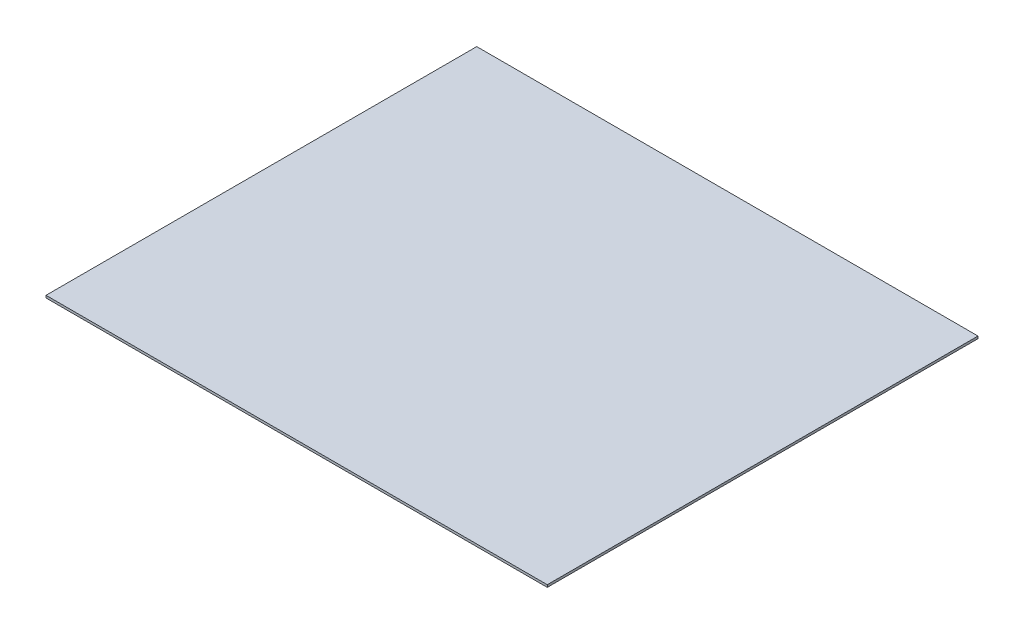
ISO-10303-21;
HEADER;
FILE_DESCRIPTION(('STEP AP214'),'2;1');
FILE_NAME('part.step','',(''),(''),'','','');
FILE_SCHEMA(('AUTOMOTIVE_DESIGN { 1 0 10303 214 1 1 1 1 }'));
ENDSEC;
DATA;
#1=APPLICATION_CONTEXT('core data for automotive mechanical design processes');
#2=APPLICATION_PROTOCOL_DEFINITION('international standard','automotive_design',2000,#1);
#3=PRODUCT_CONTEXT('',#1,'mechanical');
#4=PRODUCT('Part','Part','',(#3));
#5=PRODUCT_RELATED_PRODUCT_CATEGORY('part','',(#4));
#6=PRODUCT_DEFINITION_FORMATION('','',#4);
#7=PRODUCT_DEFINITION_CONTEXT('part definition',#1,'design');
#8=PRODUCT_DEFINITION('design','',#6,#7);
#9=PRODUCT_DEFINITION_SHAPE('','',#8);
#10=(LENGTH_UNIT() NAMED_UNIT(*) SI_UNIT(.MILLI.,.METRE.));
#11=(NAMED_UNIT(*) PLANE_ANGLE_UNIT() SI_UNIT($,.RADIAN.));
#12=(NAMED_UNIT(*) SI_UNIT($,.STERADIAN.) SOLID_ANGLE_UNIT());
#13=UNCERTAINTY_MEASURE_WITH_UNIT(LENGTH_MEASURE(1.E-05),#10,'distance_accuracy_value','');
#14=(GEOMETRIC_REPRESENTATION_CONTEXT(3) GLOBAL_UNCERTAINTY_ASSIGNED_CONTEXT((#13)) GLOBAL_UNIT_ASSIGNED_CONTEXT((#10,
#11,#12)) REPRESENTATION_CONTEXT('',''));
#15=CARTESIAN_POINT('',(0.,0.,0.));
#16=DIRECTION('',(0.,0.,1.));
#17=DIRECTION('',(1.,0.,0.));
#18=AXIS2_PLACEMENT_3D('',#15,#16,#17);
#19=CARTESIAN_POINT('',(-536.5,5.,461.));
#20=DIRECTION('',(1.,0.,0.));
#21=DIRECTION('',(0.,0.,-1.));
#22=AXIS2_PLACEMENT_3D('',#19,#20,#21);
#23=PLANE('',#22);
#24=DIRECTION('',(0.,0.,1.));
#25=VECTOR('',#24,1.);
#26=CARTESIAN_POINT('',(-536.5,0.,461.));
#27=LINE('',#26,#25);
#28=CARTESIAN_POINT('',(-536.5,0.,-461.));
#29=VERTEX_POINT('',#28);
#30=CARTESIAN_POINT('',(-536.5,0.,461.));
#31=VERTEX_POINT('',#30);
#32=EDGE_CURVE('E98',#29,#31,#27,.T.);
#33=ORIENTED_EDGE('',*,*,#32,.T.);
#34=DIRECTION('',(0.,-1.,0.));
#35=VECTOR('',#34,1.);
#36=CARTESIAN_POINT('',(-536.5,5.,461.));
#37=LINE('',#36,#35);
#38=CARTESIAN_POINT('',(-536.5,5.,461.));
#39=VERTEX_POINT('',#38);
#40=EDGE_CURVE('E11',#39,#31,#37,.T.);
#41=ORIENTED_EDGE('',*,*,#40,.F.);
#42=DIRECTION('',(0.,0.,1.));
#43=VECTOR('',#42,1.);
#44=CARTESIAN_POINT('',(-536.5,5.,461.));
#45=LINE('',#44,#43);
#46=CARTESIAN_POINT('',(-536.5,5.,-461.));
#47=VERTEX_POINT('',#46);
#48=EDGE_CURVE('E86',#47,#39,#45,.T.);
#49=ORIENTED_EDGE('',*,*,#48,.F.);
#50=DIRECTION('',(0.,-1.,0.));
#51=VECTOR('',#50,1.);
#52=CARTESIAN_POINT('',(-536.5,5.,-461.));
#53=LINE('',#52,#51);
#54=EDGE_CURVE('E94',#47,#29,#53,.T.);
#55=ORIENTED_EDGE('',*,*,#54,.T.);
#56=EDGE_LOOP('',(#33,#41,#49,#55));
#57=FACE_BOUND('',#56,.T.);
#58=ADVANCED_FACE('F35',(#57),#23,.F.);
#59=CARTESIAN_POINT('',(536.5,5.,461.));
#60=DIRECTION('',(0.,0.,-1.));
#61=DIRECTION('',(-1.,0.,0.));
#62=AXIS2_PLACEMENT_3D('',#59,#60,#61);
#63=PLANE('',#62);
#64=DIRECTION('',(1.,0.,0.));
#65=VECTOR('',#64,1.);
#66=CARTESIAN_POINT('',(536.5,0.,461.));
#67=LINE('',#66,#65);
#68=CARTESIAN_POINT('',(536.5,0.,461.));
#69=VERTEX_POINT('',#68);
#70=EDGE_CURVE('E90',#31,#69,#67,.T.);
#71=ORIENTED_EDGE('',*,*,#70,.T.);
#72=DIRECTION('',(0.,-1.,0.));
#73=VECTOR('',#72,1.);
#74=CARTESIAN_POINT('',(536.5,5.,461.));
#75=LINE('',#74,#73);
#76=CARTESIAN_POINT('',(536.5,5.,461.));
#77=VERTEX_POINT('',#76);
#78=EDGE_CURVE('E43',#77,#69,#75,.T.);
#79=ORIENTED_EDGE('',*,*,#78,.F.);
#80=DIRECTION('',(1.,0.,0.));
#81=VECTOR('',#80,1.);
#82=CARTESIAN_POINT('',(536.5,5.,461.));
#83=LINE('',#82,#81);
#84=EDGE_CURVE('E81',#39,#77,#83,.T.);
#85=ORIENTED_EDGE('',*,*,#84,.F.);
#86=ORIENTED_EDGE('',*,*,#40,.T.);
#87=EDGE_LOOP('',(#71,#79,#85,#86));
#88=FACE_BOUND('',#87,.T.);
#89=ADVANCED_FACE('F89',(#88),#63,.F.);
#90=CARTESIAN_POINT('',(536.5,5.,461.));
#91=DIRECTION('',(-1.,0.,0.));
#92=DIRECTION('',(0.,0.,1.));
#93=AXIS2_PLACEMENT_3D('',#90,#91,#92);
#94=PLANE('',#93);
#95=DIRECTION('',(0.,0.,-1.));
#96=VECTOR('',#95,1.);
#97=CARTESIAN_POINT('',(536.5,0.,461.));
#98=LINE('',#97,#96);
#99=CARTESIAN_POINT('',(536.5,0.,-461.));
#100=VERTEX_POINT('',#99);
#101=EDGE_CURVE('E68',#69,#100,#98,.T.);
#102=ORIENTED_EDGE('',*,*,#101,.T.);
#103=DIRECTION('',(0.,-1.,0.));
#104=VECTOR('',#103,1.);
#105=CARTESIAN_POINT('',(536.5,5.,-461.));
#106=LINE('',#105,#104);
#107=CARTESIAN_POINT('',(536.5,5.,-461.));
#108=VERTEX_POINT('',#107);
#109=EDGE_CURVE('E91',#108,#100,#106,.T.);
#110=ORIENTED_EDGE('',*,*,#109,.F.);
#111=DIRECTION('',(0.,0.,-1.));
#112=VECTOR('',#111,1.);
#113=CARTESIAN_POINT('',(536.5,5.,461.));
#114=LINE('',#113,#112);
#115=EDGE_CURVE('E84',#77,#108,#114,.T.);
#116=ORIENTED_EDGE('',*,*,#115,.F.);
#117=ORIENTED_EDGE('',*,*,#78,.T.);
#118=EDGE_LOOP('',(#102,#110,#116,#117));
#119=FACE_BOUND('',#118,.T.);
#120=ADVANCED_FACE('F92',(#119),#94,.F.);
#121=CARTESIAN_POINT('',(536.5,5.,-461.));
#122=DIRECTION('',(0.,0.,1.));
#123=DIRECTION('',(1.,0.,0.));
#124=AXIS2_PLACEMENT_3D('',#121,#122,#123);
#125=PLANE('',#124);
#126=DIRECTION('',(-1.,0.,0.));
#127=VECTOR('',#126,1.);
#128=CARTESIAN_POINT('',(536.5,0.,-461.));
#129=LINE('',#128,#127);
#130=EDGE_CURVE('E74',#100,#29,#129,.T.);
#131=ORIENTED_EDGE('',*,*,#130,.T.);
#132=ORIENTED_EDGE('',*,*,#54,.F.);
#133=DIRECTION('',(-1.,0.,0.));
#134=VECTOR('',#133,1.);
#135=CARTESIAN_POINT('',(536.5,5.,-461.));
#136=LINE('',#135,#134);
#137=EDGE_CURVE('E51',#108,#47,#136,.T.);
#138=ORIENTED_EDGE('',*,*,#137,.F.);
#139=ORIENTED_EDGE('',*,*,#109,.T.);
#140=EDGE_LOOP('',(#131,#132,#138,#139));
#141=FACE_BOUND('',#140,.T.);
#142=ADVANCED_FACE('F105',(#141),#125,.F.);
#143=CARTESIAN_POINT('',(-536.5,5.,-461.));
#144=DIRECTION('',(0.,1.,0.));
#145=DIRECTION('',(0.,0.,1.));
#146=AXIS2_PLACEMENT_3D('',#143,#144,#145);
#147=PLANE('',#146);
#148=ORIENTED_EDGE('',*,*,#48,.T.);
#149=ORIENTED_EDGE('',*,*,#84,.T.);
#150=ORIENTED_EDGE('',*,*,#115,.T.);
#151=ORIENTED_EDGE('',*,*,#137,.T.);
#152=EDGE_LOOP('',(#148,#149,#150,#151));
#153=FACE_BOUND('',#152,.T.);
#154=ADVANCED_FACE('F82',(#153),#147,.T.);
#155=CARTESIAN_POINT('',(-536.5,0.,-461.));
#156=DIRECTION('',(0.,1.,0.));
#157=DIRECTION('',(0.,0.,1.));
#158=AXIS2_PLACEMENT_3D('',#155,#156,#157);
#159=PLANE('',#158);
#160=ORIENTED_EDGE('',*,*,#32,.F.);
#161=ORIENTED_EDGE('',*,*,#130,.F.);
#162=ORIENTED_EDGE('',*,*,#101,.F.);
#163=ORIENTED_EDGE('',*,*,#70,.F.);
#164=EDGE_LOOP('',(#160,#161,#162,#163));
#165=FACE_BOUND('',#164,.T.);
#166=ADVANCED_FACE('F108',(#165),#159,.F.);
#167=CLOSED_SHELL('',(#58,#89,#120,#142,#154,#166));
#168=MANIFOLD_SOLID_BREP('B2',#167);
#169=ADVANCED_BREP_SHAPE_REPRESENTATION('',(#18,#168),#14);
#170=SHAPE_DEFINITION_REPRESENTATION(#9,#169);
ENDSEC;
END-ISO-10303-21;
